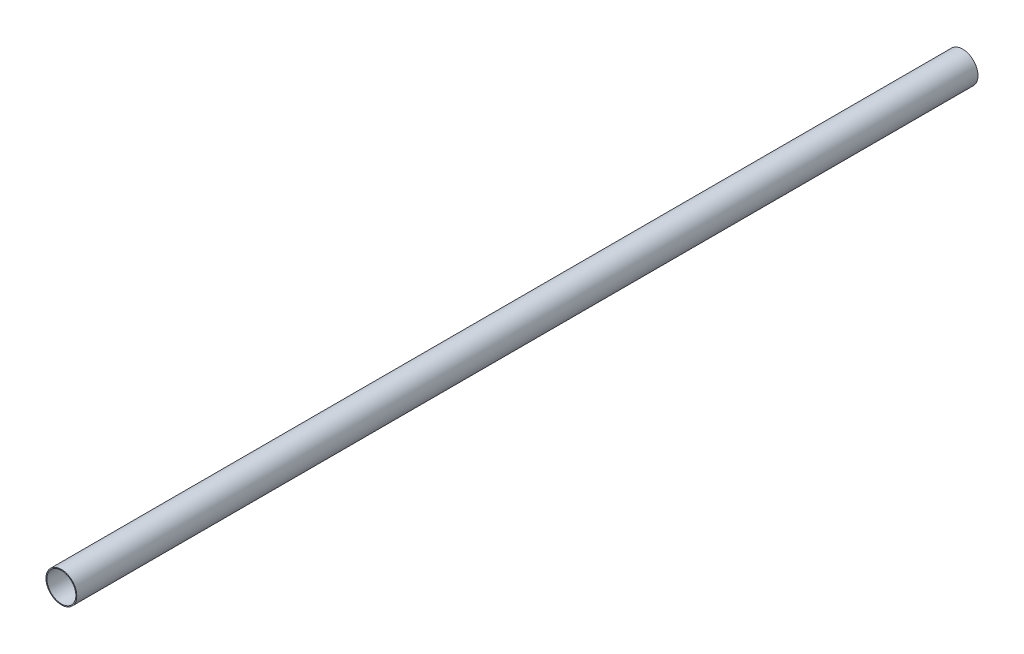
ISO-10303-21;
HEADER;
FILE_DESCRIPTION(('STEP AP214'),'2;1');
FILE_NAME('part.step','',(''),(''),'','','');
FILE_SCHEMA(('AUTOMOTIVE_DESIGN { 1 0 10303 214 1 1 1 1 }'));
ENDSEC;
DATA;
#1=APPLICATION_CONTEXT('core data for automotive mechanical design processes');
#2=APPLICATION_PROTOCOL_DEFINITION('international standard','automotive_design',2000,#1);
#3=PRODUCT_CONTEXT('',#1,'mechanical');
#4=PRODUCT('Part','Part','',(#3));
#5=PRODUCT_RELATED_PRODUCT_CATEGORY('part','',(#4));
#6=PRODUCT_DEFINITION_FORMATION('','',#4);
#7=PRODUCT_DEFINITION_CONTEXT('part definition',#1,'design');
#8=PRODUCT_DEFINITION('design','',#6,#7);
#9=PRODUCT_DEFINITION_SHAPE('','',#8);
#10=(LENGTH_UNIT() NAMED_UNIT(*) SI_UNIT(.MILLI.,.METRE.));
#11=(NAMED_UNIT(*) PLANE_ANGLE_UNIT() SI_UNIT($,.RADIAN.));
#12=(NAMED_UNIT(*) SI_UNIT($,.STERADIAN.) SOLID_ANGLE_UNIT());
#13=UNCERTAINTY_MEASURE_WITH_UNIT(LENGTH_MEASURE(1.E-05),#10,'distance_accuracy_value','');
#14=(GEOMETRIC_REPRESENTATION_CONTEXT(3) GLOBAL_UNCERTAINTY_ASSIGNED_CONTEXT((#13)) GLOBAL_UNIT_ASSIGNED_CONTEXT((#10,
#11,#12)) REPRESENTATION_CONTEXT('',''));
#15=CARTESIAN_POINT('',(0.,0.,0.));
#16=DIRECTION('',(0.,0.,1.));
#17=DIRECTION('',(1.,0.,0.));
#18=AXIS2_PLACEMENT_3D('',#15,#16,#17);
#19=CARTESIAN_POINT('',(8757.12688309938,3099.87257397583,711.2));
#20=DIRECTION('',(0.,0.,1.));
#21=DIRECTION('',(1.,0.,0.));
#22=AXIS2_PLACEMENT_3D('',#19,#20,#21);
#23=PLANE('',#22);
#24=CARTESIAN_POINT('',(8757.12688309938,3099.87257397583,711.2));
#25=DIRECTION('',(0.,0.,1.));
#26=DIRECTION('',(1.,0.,0.));
#27=AXIS2_PLACEMENT_3D('',#24,#25,#26);
#28=CIRCLE('',#27,12.1539000000013);
#29=CARTESIAN_POINT('',(8769.28078309938,3099.87257397583,711.2));
#30=VERTEX_POINT('',#29);
#31=EDGE_CURVE('E10',#30,#30,#28,.T.);
#32=ORIENTED_EDGE('',*,*,#31,.T.);
#33=EDGE_LOOP('',(#32));
#34=FACE_BOUND('',#33,.T.);
#35=CARTESIAN_POINT('',(8757.12688309938,3099.87257397583,711.2));
#36=DIRECTION('',(0.,0.,1.));
#37=DIRECTION('',(1.,0.,0.));
#38=AXIS2_PLACEMENT_3D('',#35,#36,#37);
#39=CIRCLE('',#38,11.4300000000007);
#40=CARTESIAN_POINT('',(8768.55688309938,3099.87257397583,711.2));
#41=VERTEX_POINT('',#40);
#42=EDGE_CURVE('E44',#41,#41,#39,.T.);
#43=ORIENTED_EDGE('',*,*,#42,.F.);
#44=EDGE_LOOP('',(#43));
#45=FACE_BOUND('',#44,.T.);
#46=ADVANCED_FACE('F33',(#34,#45),#23,.T.);
#47=CARTESIAN_POINT('',(8757.12688309938,3099.87257397583,0.));
#48=DIRECTION('',(0.,0.,1.));
#49=DIRECTION('',(1.,0.,0.));
#50=AXIS2_PLACEMENT_3D('',#47,#48,#49);
#51=PLANE('',#50);
#52=CARTESIAN_POINT('',(8757.12688309938,3099.87257397583,0.));
#53=DIRECTION('',(0.,0.,1.));
#54=DIRECTION('',(1.,0.,0.));
#55=AXIS2_PLACEMENT_3D('',#52,#53,#54);
#56=CIRCLE('',#55,12.1539000000013);
#57=CARTESIAN_POINT('',(8769.28078309938,3099.87257397583,0.));
#58=VERTEX_POINT('',#57);
#59=EDGE_CURVE('E37',#58,#58,#56,.T.);
#60=ORIENTED_EDGE('',*,*,#59,.F.);
#61=EDGE_LOOP('',(#60));
#62=FACE_BOUND('',#61,.T.);
#63=CARTESIAN_POINT('',(8757.12688309938,3099.87257397583,0.));
#64=DIRECTION('',(0.,0.,1.));
#65=DIRECTION('',(1.,0.,0.));
#66=AXIS2_PLACEMENT_3D('',#63,#64,#65);
#67=CIRCLE('',#66,11.4300000000007);
#68=CARTESIAN_POINT('',(8768.55688309938,3099.87257397583,0.));
#69=VERTEX_POINT('',#68);
#70=EDGE_CURVE('E46',#69,#69,#67,.T.);
#71=ORIENTED_EDGE('',*,*,#70,.T.);
#72=EDGE_LOOP('',(#71));
#73=FACE_BOUND('',#72,.T.);
#74=ADVANCED_FACE('F56',(#62,#73),#51,.F.);
#75=CARTESIAN_POINT('',(8757.12688309938,3099.87257397583,711.2));
#76=DIRECTION('',(0.,0.,-1.));
#77=DIRECTION('',(-1.,0.,0.));
#78=AXIS2_PLACEMENT_3D('',#75,#76,#77);
#79=CYLINDRICAL_SURFACE('',#78,12.1539000000013);
#80=ORIENTED_EDGE('',*,*,#31,.F.);
#81=EDGE_LOOP('',(#80));
#82=FACE_BOUND('',#81,.T.);
#83=ORIENTED_EDGE('',*,*,#59,.T.);
#84=EDGE_LOOP('',(#83));
#85=FACE_BOUND('',#84,.T.);
#86=ADVANCED_FACE('F35',(#82,#85),#79,.T.);
#87=CARTESIAN_POINT('',(8757.12688309938,3099.87257397583,711.2));
#88=DIRECTION('',(0.,0.,-1.));
#89=DIRECTION('',(-1.,0.,0.));
#90=AXIS2_PLACEMENT_3D('',#87,#88,#89);
#91=CYLINDRICAL_SURFACE('',#90,11.4300000000007);
#92=ORIENTED_EDGE('',*,*,#42,.T.);
#93=EDGE_LOOP('',(#92));
#94=FACE_BOUND('',#93,.T.);
#95=ORIENTED_EDGE('',*,*,#70,.F.);
#96=EDGE_LOOP('',(#95));
#97=FACE_BOUND('',#96,.T.);
#98=ADVANCED_FACE('F52',(#94,#97),#91,.F.);
#99=CLOSED_SHELL('',(#46,#74,#86,#98));
#100=MANIFOLD_SOLID_BREP('B2',#99);
#101=ADVANCED_BREP_SHAPE_REPRESENTATION('',(#18,#100),#14);
#102=SHAPE_DEFINITION_REPRESENTATION(#9,#101);
ENDSEC;
END-ISO-10303-21;
